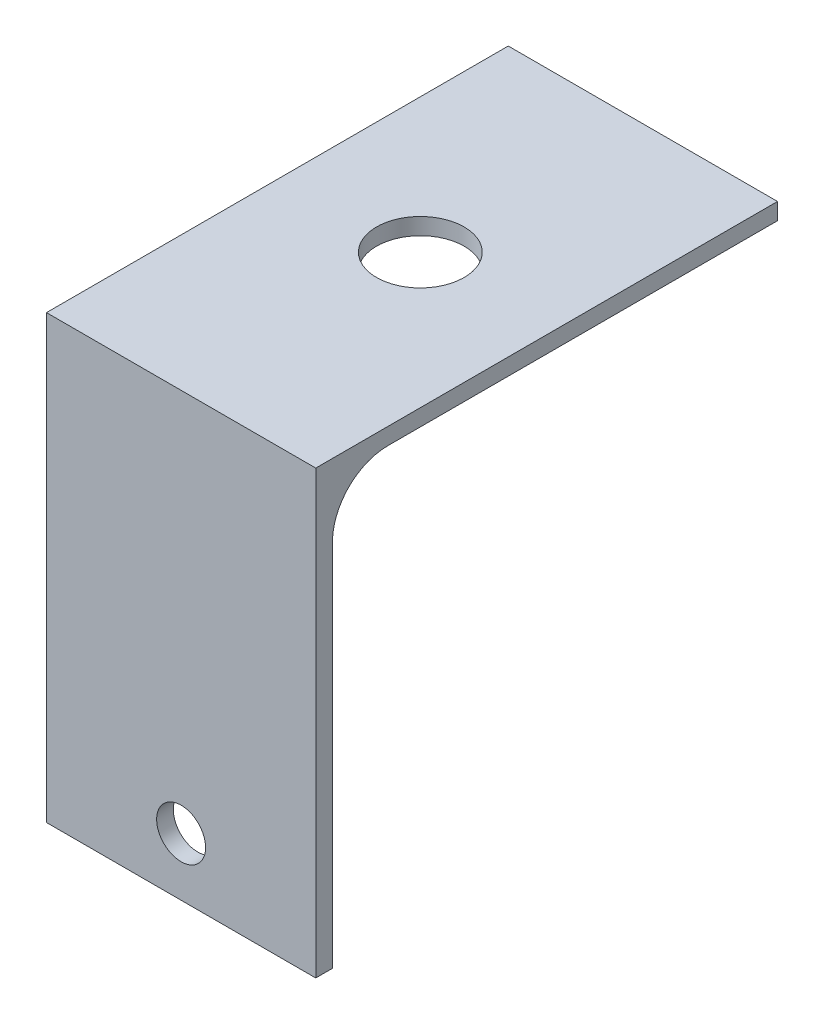
ISO-10303-21;
HEADER;
FILE_DESCRIPTION(('STEP AP214'),'2;1');
FILE_NAME('part.step','',(''),(''),'','','');
FILE_SCHEMA(('AUTOMOTIVE_DESIGN { 1 0 10303 214 1 1 1 1 }'));
ENDSEC;
DATA;
#1=APPLICATION_CONTEXT('core data for automotive mechanical design processes');
#2=APPLICATION_PROTOCOL_DEFINITION('international standard','automotive_design',2000,#1);
#3=PRODUCT_CONTEXT('',#1,'mechanical');
#4=PRODUCT('Part','Part','',(#3));
#5=PRODUCT_RELATED_PRODUCT_CATEGORY('part','',(#4));
#6=PRODUCT_DEFINITION_FORMATION('','',#4);
#7=PRODUCT_DEFINITION_CONTEXT('part definition',#1,'design');
#8=PRODUCT_DEFINITION('design','',#6,#7);
#9=PRODUCT_DEFINITION_SHAPE('','',#8);
#10=(LENGTH_UNIT() NAMED_UNIT(*) SI_UNIT(.MILLI.,.METRE.));
#11=(NAMED_UNIT(*) PLANE_ANGLE_UNIT() SI_UNIT($,.RADIAN.));
#12=(NAMED_UNIT(*) SI_UNIT($,.STERADIAN.) SOLID_ANGLE_UNIT());
#13=UNCERTAINTY_MEASURE_WITH_UNIT(LENGTH_MEASURE(1.E-05),#10,'distance_accuracy_value','');
#14=(GEOMETRIC_REPRESENTATION_CONTEXT(3) GLOBAL_UNCERTAINTY_ASSIGNED_CONTEXT((#13)) GLOBAL_UNIT_ASSIGNED_CONTEXT((#10,
#11,#12)) REPRESENTATION_CONTEXT('',''));
#15=CARTESIAN_POINT('',(0.,0.,0.));
#16=DIRECTION('',(0.,0.,1.));
#17=DIRECTION('',(1.,0.,0.));
#18=AXIS2_PLACEMENT_3D('',#15,#16,#17);
#19=CARTESIAN_POINT('',(0.,13.345,-5.));
#20=DIRECTION('',(-1.,0.,0.));
#21=DIRECTION('',(0.,0.,1.));
#22=AXIS2_PLACEMENT_3D('',#19,#20,#21);
#23=CYLINDRICAL_SURFACE('',#22,5.);
#24=DIRECTION('',(-1.,0.,0.));
#25=VECTOR('',#24,1.);
#26=CARTESIAN_POINT('',(0.,18.345,-5.));
#27=LINE('',#26,#25);
#28=CARTESIAN_POINT('',(12.1,18.345,-5.));
#29=VERTEX_POINT('',#28);
#30=CARTESIAN_POINT('',(-12.1,18.345,-5.));
#31=VERTEX_POINT('',#30);
#32=EDGE_CURVE('E184',#29,#31,#27,.T.);
#33=ORIENTED_EDGE('',*,*,#32,.F.);
#34=CARTESIAN_POINT('',(12.1,13.345,-5.));
#35=DIRECTION('',(-1.,0.,0.));
#36=DIRECTION('',(0.,0.,1.));
#37=AXIS2_PLACEMENT_3D('',#34,#35,#36);
#38=CIRCLE('',#37,5.);
#39=CARTESIAN_POINT('',(12.1,13.345,0.));
#40=VERTEX_POINT('',#39);
#41=EDGE_CURVE('E57',#29,#40,#38,.F.);
#42=ORIENTED_EDGE('',*,*,#41,.T.);
#43=DIRECTION('',(-1.,0.,0.));
#44=VECTOR('',#43,1.);
#45=CARTESIAN_POINT('',(0.,13.345,0.));
#46=LINE('',#45,#44);
#47=CARTESIAN_POINT('',(-12.1,13.345,0.));
#48=VERTEX_POINT('',#47);
#49=EDGE_CURVE('E187',#48,#40,#46,.F.);
#50=ORIENTED_EDGE('',*,*,#49,.F.);
#51=CARTESIAN_POINT('',(-12.1,13.345,-5.));
#52=DIRECTION('',(1.,0.,0.));
#53=DIRECTION('',(0.,0.,-1.));
#54=AXIS2_PLACEMENT_3D('',#51,#52,#53);
#55=CIRCLE('',#54,5.);
#56=EDGE_CURVE('E11',#48,#31,#55,.F.);
#57=ORIENTED_EDGE('',*,*,#56,.T.);
#58=EDGE_LOOP('',(#33,#42,#50,#57));
#59=FACE_BOUND('',#58,.T.);
#60=ADVANCED_FACE('F49',(#59),#23,.F.);
#61=CARTESIAN_POINT('',(-12.1,-19.845,1.5));
#62=DIRECTION('',(1.,0.,0.));
#63=DIRECTION('',(0.,0.,-1.));
#64=AXIS2_PLACEMENT_3D('',#61,#62,#63);
#65=PLANE('',#64);
#66=ORIENTED_EDGE('',*,*,#56,.F.);
#67=DIRECTION('',(0.,-1.,0.));
#68=VECTOR('',#67,1.);
#69=CARTESIAN_POINT('',(-12.1,-19.845,0.));
#70=LINE('',#69,#68);
#71=CARTESIAN_POINT('',(-12.1,-19.845,0.));
#72=VERTEX_POINT('',#71);
#73=EDGE_CURVE('E145',#48,#72,#70,.T.);
#74=ORIENTED_EDGE('',*,*,#73,.T.);
#75=DIRECTION('',(0.,0.,-1.));
#76=VECTOR('',#75,1.);
#77=CARTESIAN_POINT('',(-12.1,-19.845,1.5));
#78=LINE('',#77,#76);
#79=CARTESIAN_POINT('',(-12.1,-19.845,1.5));
#80=VERTEX_POINT('',#79);
#81=EDGE_CURVE('E180',#80,#72,#78,.T.);
#82=ORIENTED_EDGE('',*,*,#81,.F.);
#83=DIRECTION('',(0.,-1.,0.));
#84=VECTOR('',#83,1.);
#85=CARTESIAN_POINT('',(-12.1,-19.845,1.5));
#86=LINE('',#85,#84);
#87=CARTESIAN_POINT('',(-12.1,19.845,1.5));
#88=VERTEX_POINT('',#87);
#89=EDGE_CURVE('E149',#88,#80,#86,.T.);
#90=ORIENTED_EDGE('',*,*,#89,.F.);
#91=DIRECTION('',(0.,0.,-1.));
#92=VECTOR('',#91,1.);
#93=CARTESIAN_POINT('',(-12.1,19.845,1.5));
#94=LINE('',#93,#92);
#95=CARTESIAN_POINT('',(-12.1,19.845,-40.));
#96=VERTEX_POINT('',#95);
#97=EDGE_CURVE('E163',#88,#96,#94,.T.);
#98=ORIENTED_EDGE('',*,*,#97,.T.);
#99=DIRECTION('',(0.,1.,0.));
#100=VECTOR('',#99,1.);
#101=CARTESIAN_POINT('',(-12.1,18.345,-40.));
#102=LINE('',#101,#100);
#103=CARTESIAN_POINT('',(-12.1,18.345,-40.));
#104=VERTEX_POINT('',#103);
#105=EDGE_CURVE('E126',#104,#96,#102,.T.);
#106=ORIENTED_EDGE('',*,*,#105,.F.);
#107=DIRECTION('',(0.,0.,1.));
#108=VECTOR('',#107,1.);
#109=CARTESIAN_POINT('',(-12.1,18.345,0.));
#110=LINE('',#109,#108);
#111=EDGE_CURVE('E117',#104,#31,#110,.T.);
#112=ORIENTED_EDGE('',*,*,#111,.T.);
#113=EDGE_LOOP('',(#66,#74,#82,#90,#98,#106,#112));
#114=FACE_BOUND('',#113,.T.);
#115=ADVANCED_FACE('F262',(#114),#65,.F.);
#116=CARTESIAN_POINT('',(12.1,-19.845,1.5));
#117=DIRECTION('',(0.,1.,0.));
#118=DIRECTION('',(-1.,0.,0.));
#119=AXIS2_PLACEMENT_3D('',#116,#117,#118);
#120=PLANE('',#119);
#121=DIRECTION('',(1.,0.,0.));
#122=VECTOR('',#121,1.);
#123=CARTESIAN_POINT('',(12.1,-19.845,0.));
#124=LINE('',#123,#122);
#125=CARTESIAN_POINT('',(12.1,-19.845,0.));
#126=VERTEX_POINT('',#125);
#127=EDGE_CURVE('E166',#72,#126,#124,.T.);
#128=ORIENTED_EDGE('',*,*,#127,.T.);
#129=DIRECTION('',(0.,0.,-1.));
#130=VECTOR('',#129,1.);
#131=CARTESIAN_POINT('',(12.1,-19.845,1.5));
#132=LINE('',#131,#130);
#133=CARTESIAN_POINT('',(12.1,-19.845,1.5));
#134=VERTEX_POINT('',#133);
#135=EDGE_CURVE('E176',#134,#126,#132,.T.);
#136=ORIENTED_EDGE('',*,*,#135,.F.);
#137=DIRECTION('',(1.,0.,0.));
#138=VECTOR('',#137,1.);
#139=CARTESIAN_POINT('',(12.1,-19.845,1.5));
#140=LINE('',#139,#138);
#141=EDGE_CURVE('E153',#80,#134,#140,.T.);
#142=ORIENTED_EDGE('',*,*,#141,.F.);
#143=ORIENTED_EDGE('',*,*,#81,.T.);
#144=EDGE_LOOP('',(#128,#136,#142,#143));
#145=FACE_BOUND('',#144,.T.);
#146=ADVANCED_FACE('F267',(#145),#120,.F.);
#147=CARTESIAN_POINT('',(12.1,-19.845,1.5));
#148=DIRECTION('',(-1.,0.,0.));
#149=DIRECTION('',(0.,0.,1.));
#150=AXIS2_PLACEMENT_3D('',#147,#148,#149);
#151=PLANE('',#150);
#152=ORIENTED_EDGE('',*,*,#41,.F.);
#153=DIRECTION('',(0.,0.,-1.));
#154=VECTOR('',#153,1.);
#155=CARTESIAN_POINT('',(12.1,18.345,0.));
#156=LINE('',#155,#154);
#157=CARTESIAN_POINT('',(12.1,18.345,-40.));
#158=VERTEX_POINT('',#157);
#159=EDGE_CURVE('E105',#29,#158,#156,.T.);
#160=ORIENTED_EDGE('',*,*,#159,.T.);
#161=DIRECTION('',(0.,1.,0.));
#162=VECTOR('',#161,1.);
#163=CARTESIAN_POINT('',(12.1,18.345,-40.));
#164=LINE('',#163,#162);
#165=CARTESIAN_POINT('',(12.1,19.845,-40.));
#166=VERTEX_POINT('',#165);
#167=EDGE_CURVE('E109',#158,#166,#164,.T.);
#168=ORIENTED_EDGE('',*,*,#167,.T.);
#169=DIRECTION('',(0.,0.,-1.));
#170=VECTOR('',#169,1.);
#171=CARTESIAN_POINT('',(12.1,19.845,1.5));
#172=LINE('',#171,#170);
#173=CARTESIAN_POINT('',(12.1,19.845,1.5));
#174=VERTEX_POINT('',#173);
#175=EDGE_CURVE('E173',#174,#166,#172,.T.);
#176=ORIENTED_EDGE('',*,*,#175,.F.);
#177=DIRECTION('',(0.,1.,0.));
#178=VECTOR('',#177,1.);
#179=CARTESIAN_POINT('',(12.1,-19.845,1.5));
#180=LINE('',#179,#178);
#181=EDGE_CURVE('E157',#134,#174,#180,.T.);
#182=ORIENTED_EDGE('',*,*,#181,.F.);
#183=ORIENTED_EDGE('',*,*,#135,.T.);
#184=DIRECTION('',(0.,1.,0.));
#185=VECTOR('',#184,1.);
#186=CARTESIAN_POINT('',(12.1,-19.845,0.));
#187=LINE('',#186,#185);
#188=EDGE_CURVE('E154',#126,#40,#187,.T.);
#189=ORIENTED_EDGE('',*,*,#188,.T.);
#190=EDGE_LOOP('',(#152,#160,#168,#176,#182,#183,#189));
#191=FACE_BOUND('',#190,.T.);
#192=ADVANCED_FACE('F107',(#191),#151,.F.);
#193=CARTESIAN_POINT('',(12.1,19.845,1.5));
#194=DIRECTION('',(0.,-1.,0.));
#195=DIRECTION('',(1.,0.,0.));
#196=AXIS2_PLACEMENT_3D('',#193,#194,#195);
#197=PLANE('',#196);
#198=CARTESIAN_POINT('',(0.,19.845,-20.));
#199=DIRECTION('',(0.,-1.,0.));
#200=DIRECTION('',(0.,0.,-1.));
#201=AXIS2_PLACEMENT_3D('',#198,#199,#200);
#202=CIRCLE('',#201,3.937);
#203=CARTESIAN_POINT('',(0.,19.845,-23.937));
#204=VERTEX_POINT('',#203);
#205=EDGE_CURVE('E137',#204,#204,#202,.T.);
#206=ORIENTED_EDGE('',*,*,#205,.T.);
#207=EDGE_LOOP('',(#206));
#208=FACE_BOUND('',#207,.T.);
#209=ORIENTED_EDGE('',*,*,#175,.T.);
#210=DIRECTION('',(-1.,0.,0.));
#211=VECTOR('',#210,1.);
#212=CARTESIAN_POINT('',(-12.1,19.845,-40.));
#213=LINE('',#212,#211);
#214=EDGE_CURVE('E124',#166,#96,#213,.T.);
#215=ORIENTED_EDGE('',*,*,#214,.T.);
#216=ORIENTED_EDGE('',*,*,#97,.F.);
#217=DIRECTION('',(-1.,0.,0.));
#218=VECTOR('',#217,1.);
#219=CARTESIAN_POINT('',(12.1,19.845,1.5));
#220=LINE('',#219,#218);
#221=EDGE_CURVE('E160',#174,#88,#220,.T.);
#222=ORIENTED_EDGE('',*,*,#221,.F.);
#223=EDGE_LOOP('',(#209,#215,#216,#222));
#224=FACE_BOUND('',#223,.T.);
#225=ADVANCED_FACE('F271',(#208,#224),#197,.F.);
#226=CARTESIAN_POINT('',(0.,0.,1.5));
#227=DIRECTION('',(0.,0.,1.));
#228=DIRECTION('',(1.,0.,0.));
#229=AXIS2_PLACEMENT_3D('',#226,#227,#228);
#230=PLANE('',#229);
#231=CARTESIAN_POINT('',(0.,-14.645,1.5));
#232=DIRECTION('',(0.,0.,1.));
#233=DIRECTION('',(1.,0.,0.));
#234=AXIS2_PLACEMENT_3D('',#231,#232,#233);
#235=CIRCLE('',#234,2.2);
#236=CARTESIAN_POINT('',(2.2,-14.645,1.5));
#237=VERTEX_POINT('',#236);
#238=EDGE_CURVE('E139',#237,#237,#235,.T.);
#239=ORIENTED_EDGE('',*,*,#238,.F.);
#240=EDGE_LOOP('',(#239));
#241=FACE_BOUND('',#240,.T.);
#242=ORIENTED_EDGE('',*,*,#89,.T.);
#243=ORIENTED_EDGE('',*,*,#141,.T.);
#244=ORIENTED_EDGE('',*,*,#181,.T.);
#245=ORIENTED_EDGE('',*,*,#221,.T.);
#246=EDGE_LOOP('',(#242,#243,#244,#245));
#247=FACE_BOUND('',#246,.T.);
#248=ADVANCED_FACE('F277',(#241,#247),#230,.T.);
#249=CARTESIAN_POINT('',(0.,0.,0.));
#250=DIRECTION('',(0.,0.,1.));
#251=DIRECTION('',(1.,0.,0.));
#252=AXIS2_PLACEMENT_3D('',#249,#250,#251);
#253=PLANE('',#252);
#254=CARTESIAN_POINT('',(0.,-14.645,0.));
#255=DIRECTION('',(0.,0.,1.));
#256=DIRECTION('',(1.,0.,0.));
#257=AXIS2_PLACEMENT_3D('',#254,#255,#256);
#258=CIRCLE('',#257,2.2);
#259=CARTESIAN_POINT('',(2.2,-14.645,0.));
#260=VERTEX_POINT('',#259);
#261=EDGE_CURVE('E141',#260,#260,#258,.T.);
#262=ORIENTED_EDGE('',*,*,#261,.T.);
#263=EDGE_LOOP('',(#262));
#264=FACE_BOUND('',#263,.T.);
#265=ORIENTED_EDGE('',*,*,#73,.F.);
#266=ORIENTED_EDGE('',*,*,#49,.T.);
#267=ORIENTED_EDGE('',*,*,#188,.F.);
#268=ORIENTED_EDGE('',*,*,#127,.F.);
#269=EDGE_LOOP('',(#265,#266,#267,#268));
#270=FACE_BOUND('',#269,.T.);
#271=ADVANCED_FACE('F283',(#264,#270),#253,.F.);
#272=CARTESIAN_POINT('',(0.,-14.645,0.));
#273=DIRECTION('',(0.,0.,1.));
#274=DIRECTION('',(1.,0.,0.));
#275=AXIS2_PLACEMENT_3D('',#272,#273,#274);
#276=CYLINDRICAL_SURFACE('',#275,2.2);
#277=ORIENTED_EDGE('',*,*,#261,.F.);
#278=EDGE_LOOP('',(#277));
#279=FACE_BOUND('',#278,.T.);
#280=ORIENTED_EDGE('',*,*,#238,.T.);
#281=EDGE_LOOP('',(#280));
#282=FACE_BOUND('',#281,.T.);
#283=ADVANCED_FACE('F259',(#279,#282),#276,.F.);
#284=CARTESIAN_POINT('',(-12.1,18.345,-40.));
#285=DIRECTION('',(0.,0.,-1.));
#286=DIRECTION('',(-1.,0.,0.));
#287=AXIS2_PLACEMENT_3D('',#284,#285,#286);
#288=PLANE('',#287);
#289=ORIENTED_EDGE('',*,*,#214,.F.);
#290=ORIENTED_EDGE('',*,*,#167,.F.);
#291=DIRECTION('',(-1.,0.,0.));
#292=VECTOR('',#291,1.);
#293=CARTESIAN_POINT('',(-12.1,18.345,-40.));
#294=LINE('',#293,#292);
#295=EDGE_CURVE('E116',#158,#104,#294,.T.);
#296=ORIENTED_EDGE('',*,*,#295,.T.);
#297=ORIENTED_EDGE('',*,*,#105,.T.);
#298=EDGE_LOOP('',(#289,#290,#296,#297));
#299=FACE_BOUND('',#298,.T.);
#300=ADVANCED_FACE('F121',(#299),#288,.T.);
#301=CARTESIAN_POINT('',(0.,18.345,0.));
#302=DIRECTION('',(0.,-1.,0.));
#303=DIRECTION('',(0.,0.,-1.));
#304=AXIS2_PLACEMENT_3D('',#301,#302,#303);
#305=PLANE('',#304);
#306=CARTESIAN_POINT('',(0.,18.345,-20.));
#307=DIRECTION('',(0.,-1.,0.));
#308=DIRECTION('',(0.,0.,-1.));
#309=AXIS2_PLACEMENT_3D('',#306,#307,#308);
#310=CIRCLE('',#309,3.937);
#311=CARTESIAN_POINT('',(0.,18.345,-23.937));
#312=VERTEX_POINT('',#311);
#313=EDGE_CURVE('E240',#312,#312,#310,.T.);
#314=ORIENTED_EDGE('',*,*,#313,.F.);
#315=EDGE_LOOP('',(#314));
#316=FACE_BOUND('',#315,.T.);
#317=ORIENTED_EDGE('',*,*,#159,.F.);
#318=ORIENTED_EDGE('',*,*,#32,.T.);
#319=ORIENTED_EDGE('',*,*,#111,.F.);
#320=ORIENTED_EDGE('',*,*,#295,.F.);
#321=EDGE_LOOP('',(#317,#318,#319,#320));
#322=FACE_BOUND('',#321,.T.);
#323=ADVANCED_FACE('F129',(#316,#322),#305,.T.);
#324=CARTESIAN_POINT('',(0.,19.845,-20.));
#325=DIRECTION('',(0.,-1.,0.));
#326=DIRECTION('',(0.,0.,-1.));
#327=AXIS2_PLACEMENT_3D('',#324,#325,#326);
#328=CYLINDRICAL_SURFACE('',#327,3.937);
#329=ORIENTED_EDGE('',*,*,#205,.F.);
#330=EDGE_LOOP('',(#329));
#331=FACE_BOUND('',#330,.T.);
#332=ORIENTED_EDGE('',*,*,#313,.T.);
#333=EDGE_LOOP('',(#332));
#334=FACE_BOUND('',#333,.T.);
#335=ADVANCED_FACE('F248',(#331,#334),#328,.F.);
#336=CLOSED_SHELL('',(#60,#115,#146,#192,#225,#248,#271,#283,#300,#323,#335));
#337=MANIFOLD_SOLID_BREP('B2',#336);
#338=ADVANCED_BREP_SHAPE_REPRESENTATION('',(#18,#337),#14);
#339=SHAPE_DEFINITION_REPRESENTATION(#9,#338);
ENDSEC;
END-ISO-10303-21;
